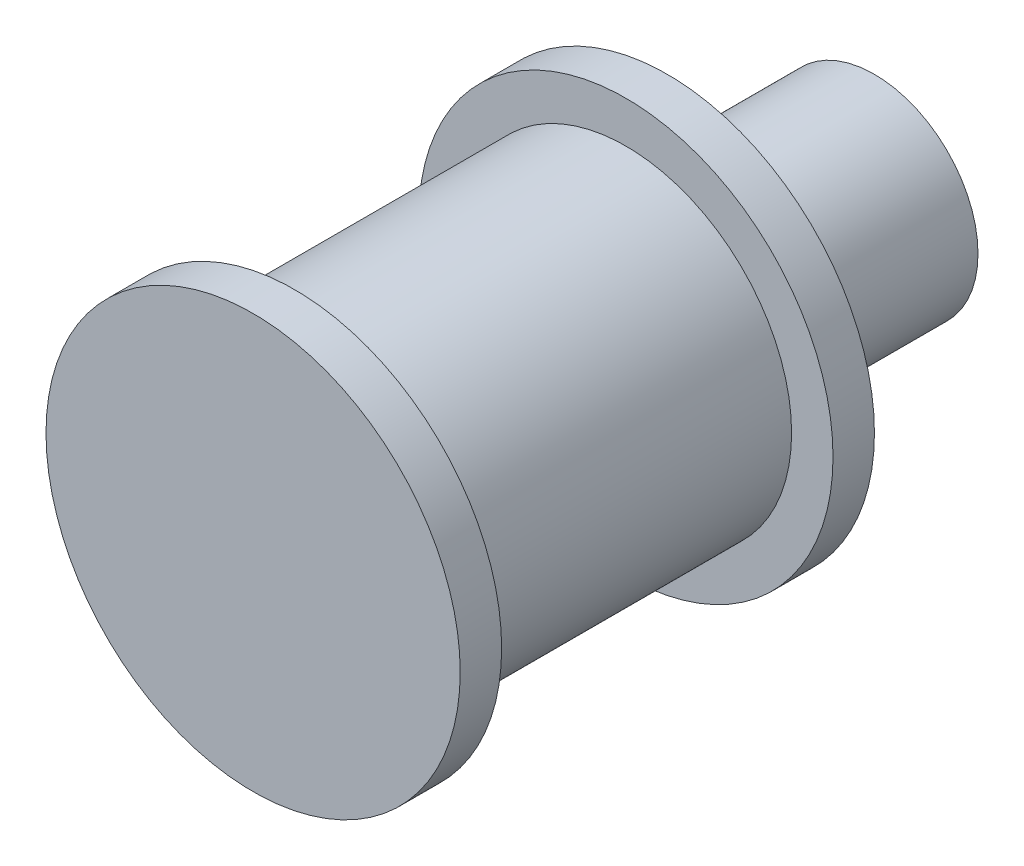
ISO-10303-21;
HEADER;
FILE_DESCRIPTION(('STEP AP214'),'2;1');
FILE_NAME('part.step','',(''),(''),'','','');
FILE_SCHEMA(('AUTOMOTIVE_DESIGN { 1 0 10303 214 1 1 1 1 }'));
ENDSEC;
DATA;
#1=APPLICATION_CONTEXT('core data for automotive mechanical design processes');
#2=APPLICATION_PROTOCOL_DEFINITION('international standard','automotive_design',2000,#1);
#3=PRODUCT_CONTEXT('',#1,'mechanical');
#4=PRODUCT('Part','Part','',(#3));
#5=PRODUCT_RELATED_PRODUCT_CATEGORY('part','',(#4));
#6=PRODUCT_DEFINITION_FORMATION('','',#4);
#7=PRODUCT_DEFINITION_CONTEXT('part definition',#1,'design');
#8=PRODUCT_DEFINITION('design','',#6,#7);
#9=PRODUCT_DEFINITION_SHAPE('','',#8);
#10=(LENGTH_UNIT() NAMED_UNIT(*) SI_UNIT(.MILLI.,.METRE.));
#11=(NAMED_UNIT(*) PLANE_ANGLE_UNIT() SI_UNIT($,.RADIAN.));
#12=(NAMED_UNIT(*) SI_UNIT($,.STERADIAN.) SOLID_ANGLE_UNIT());
#13=UNCERTAINTY_MEASURE_WITH_UNIT(LENGTH_MEASURE(1.E-05),#10,'distance_accuracy_value','');
#14=(GEOMETRIC_REPRESENTATION_CONTEXT(3) GLOBAL_UNCERTAINTY_ASSIGNED_CONTEXT((#13)) GLOBAL_UNIT_ASSIGNED_CONTEXT((#10,
#11,#12)) REPRESENTATION_CONTEXT('',''));
#15=CARTESIAN_POINT('',(0.,0.,0.));
#16=DIRECTION('',(0.,0.,1.));
#17=DIRECTION('',(1.,0.,0.));
#18=AXIS2_PLACEMENT_3D('',#15,#16,#17);
#19=CARTESIAN_POINT('',(0.,0.,5.));
#20=DIRECTION('',(0.,0.,-1.));
#21=DIRECTION('',(-1.,0.,0.));
#22=AXIS2_PLACEMENT_3D('',#19,#20,#21);
#23=CYLINDRICAL_SURFACE('',#22,2.5);
#24=CARTESIAN_POINT('',(0.,0.,5.));
#25=DIRECTION('',(0.,0.,1.));
#26=DIRECTION('',(1.,0.,0.));
#27=AXIS2_PLACEMENT_3D('',#24,#25,#26);
#28=CIRCLE('',#27,2.5);
#29=CARTESIAN_POINT('',(2.5,0.,5.));
#30=VERTEX_POINT('',#29);
#31=EDGE_CURVE('E38',#30,#30,#28,.T.);
#32=ORIENTED_EDGE('',*,*,#31,.F.);
#33=EDGE_LOOP('',(#32));
#34=FACE_BOUND('',#33,.T.);
#35=CARTESIAN_POINT('',(0.,0.,0.));
#36=DIRECTION('',(0.,0.,1.));
#37=DIRECTION('',(1.,0.,0.));
#38=AXIS2_PLACEMENT_3D('',#35,#36,#37);
#39=CIRCLE('',#38,2.5);
#40=CARTESIAN_POINT('',(2.5,0.,0.));
#41=VERTEX_POINT('',#40);
#42=EDGE_CURVE('E34',#41,#41,#39,.T.);
#43=ORIENTED_EDGE('',*,*,#42,.T.);
#44=EDGE_LOOP('',(#43));
#45=FACE_BOUND('',#44,.T.);
#46=ADVANCED_FACE('F31',(#34,#45),#23,.T.);
#47=CARTESIAN_POINT('',(0.,0.,0.));
#48=DIRECTION('',(0.,0.,1.));
#49=DIRECTION('',(1.,0.,0.));
#50=AXIS2_PLACEMENT_3D('',#47,#48,#49);
#51=PLANE('',#50);
#52=ORIENTED_EDGE('',*,*,#42,.F.);
#53=EDGE_LOOP('',(#52));
#54=FACE_BOUND('',#53,.T.);
#55=ADVANCED_FACE('F78',(#54),#51,.F.);
#56=CARTESIAN_POINT('',(0.,0.,6.));
#57=DIRECTION('',(0.,0.,-1.));
#58=DIRECTION('',(-1.,0.,0.));
#59=AXIS2_PLACEMENT_3D('',#56,#57,#58);
#60=CYLINDRICAL_SURFACE('',#59,5.);
#61=CARTESIAN_POINT('',(0.,0.,6.));
#62=DIRECTION('',(0.,0.,1.));
#63=DIRECTION('',(1.,0.,0.));
#64=AXIS2_PLACEMENT_3D('',#61,#62,#63);
#65=CIRCLE('',#64,5.);
#66=CARTESIAN_POINT('',(5.,0.,6.));
#67=VERTEX_POINT('',#66);
#68=EDGE_CURVE('E47',#67,#67,#65,.T.);
#69=ORIENTED_EDGE('',*,*,#68,.F.);
#70=EDGE_LOOP('',(#69));
#71=FACE_BOUND('',#70,.T.);
#72=CARTESIAN_POINT('',(0.,0.,5.));
#73=DIRECTION('',(0.,0.,1.));
#74=DIRECTION('',(1.,0.,0.));
#75=AXIS2_PLACEMENT_3D('',#72,#73,#74);
#76=CIRCLE('',#75,5.);
#77=CARTESIAN_POINT('',(5.,0.,5.));
#78=VERTEX_POINT('',#77);
#79=EDGE_CURVE('E50',#78,#78,#76,.T.);
#80=ORIENTED_EDGE('',*,*,#79,.T.);
#81=EDGE_LOOP('',(#80));
#82=FACE_BOUND('',#81,.T.);
#83=ADVANCED_FACE('F83',(#71,#82),#60,.T.);
#84=CARTESIAN_POINT('',(0.,0.,6.));
#85=DIRECTION('',(0.,0.,1.));
#86=DIRECTION('',(1.,0.,0.));
#87=AXIS2_PLACEMENT_3D('',#84,#85,#86);
#88=PLANE('',#87);
#89=CARTESIAN_POINT('',(0.,0.,6.));
#90=DIRECTION('',(0.,0.,1.));
#91=DIRECTION('',(1.,0.,0.));
#92=AXIS2_PLACEMENT_3D('',#89,#90,#91);
#93=CIRCLE('',#92,4.);
#94=CARTESIAN_POINT('',(4.,0.,6.));
#95=VERTEX_POINT('',#94);
#96=EDGE_CURVE('E10',#95,#95,#93,.T.);
#97=ORIENTED_EDGE('',*,*,#96,.F.);
#98=EDGE_LOOP('',(#97));
#99=FACE_BOUND('',#98,.T.);
#100=ORIENTED_EDGE('',*,*,#68,.T.);
#101=EDGE_LOOP('',(#100));
#102=FACE_BOUND('',#101,.T.);
#103=ADVANCED_FACE('F94',(#99,#102),#88,.T.);
#104=CARTESIAN_POINT('',(0.,0.,5.));
#105=DIRECTION('',(0.,0.,1.));
#106=DIRECTION('',(1.,0.,0.));
#107=AXIS2_PLACEMENT_3D('',#104,#105,#106);
#108=PLANE('',#107);
#109=ORIENTED_EDGE('',*,*,#31,.T.);
#110=EDGE_LOOP('',(#109));
#111=FACE_BOUND('',#110,.T.);
#112=ORIENTED_EDGE('',*,*,#79,.F.);
#113=EDGE_LOOP('',(#112));
#114=FACE_BOUND('',#113,.T.);
#115=ADVANCED_FACE('F90',(#111,#114),#108,.F.);
#116=CARTESIAN_POINT('',(0.,0.,14.));
#117=DIRECTION('',(0.,0.,-1.));
#118=DIRECTION('',(-1.,0.,0.));
#119=AXIS2_PLACEMENT_3D('',#116,#117,#118);
#120=CYLINDRICAL_SURFACE('',#119,4.);
#121=CARTESIAN_POINT('',(0.,0.,14.));
#122=DIRECTION('',(0.,0.,1.));
#123=DIRECTION('',(1.,0.,0.));
#124=AXIS2_PLACEMENT_3D('',#121,#122,#123);
#125=CIRCLE('',#124,4.);
#126=CARTESIAN_POINT('',(4.,0.,14.));
#127=VERTEX_POINT('',#126);
#128=EDGE_CURVE('E45',#127,#127,#125,.T.);
#129=ORIENTED_EDGE('',*,*,#128,.F.);
#130=EDGE_LOOP('',(#129));
#131=FACE_BOUND('',#130,.T.);
#132=ORIENTED_EDGE('',*,*,#96,.T.);
#133=EDGE_LOOP('',(#132));
#134=FACE_BOUND('',#133,.T.);
#135=ADVANCED_FACE('F93',(#131,#134),#120,.T.);
#136=CARTESIAN_POINT('',(0.,0.,15.));
#137=DIRECTION('',(0.,0.,-1.));
#138=DIRECTION('',(-1.,0.,0.));
#139=AXIS2_PLACEMENT_3D('',#136,#137,#138);
#140=CYLINDRICAL_SURFACE('',#139,5.);
#141=CARTESIAN_POINT('',(0.,0.,15.));
#142=DIRECTION('',(0.,0.,1.));
#143=DIRECTION('',(1.,0.,0.));
#144=AXIS2_PLACEMENT_3D('',#141,#142,#143);
#145=CIRCLE('',#144,5.);
#146=CARTESIAN_POINT('',(5.,0.,15.));
#147=VERTEX_POINT('',#146);
#148=EDGE_CURVE('E55',#147,#147,#145,.T.);
#149=ORIENTED_EDGE('',*,*,#148,.F.);
#150=EDGE_LOOP('',(#149));
#151=FACE_BOUND('',#150,.T.);
#152=CARTESIAN_POINT('',(0.,0.,14.));
#153=DIRECTION('',(0.,0.,1.));
#154=DIRECTION('',(1.,0.,0.));
#155=AXIS2_PLACEMENT_3D('',#152,#153,#154);
#156=CIRCLE('',#155,5.);
#157=CARTESIAN_POINT('',(5.,0.,14.));
#158=VERTEX_POINT('',#157);
#159=EDGE_CURVE('E59',#158,#158,#156,.T.);
#160=ORIENTED_EDGE('',*,*,#159,.T.);
#161=EDGE_LOOP('',(#160));
#162=FACE_BOUND('',#161,.T.);
#163=ADVANCED_FACE('F66',(#151,#162),#140,.T.);
#164=CARTESIAN_POINT('',(0.,0.,15.));
#165=DIRECTION('',(0.,0.,1.));
#166=DIRECTION('',(1.,0.,0.));
#167=AXIS2_PLACEMENT_3D('',#164,#165,#166);
#168=PLANE('',#167);
#169=ORIENTED_EDGE('',*,*,#148,.T.);
#170=EDGE_LOOP('',(#169));
#171=FACE_BOUND('',#170,.T.);
#172=ADVANCED_FACE('F70',(#171),#168,.T.);
#173=CARTESIAN_POINT('',(0.,0.,14.));
#174=DIRECTION('',(0.,0.,1.));
#175=DIRECTION('',(1.,0.,0.));
#176=AXIS2_PLACEMENT_3D('',#173,#174,#175);
#177=PLANE('',#176);
#178=ORIENTED_EDGE('',*,*,#128,.T.);
#179=EDGE_LOOP('',(#178));
#180=FACE_BOUND('',#179,.T.);
#181=ORIENTED_EDGE('',*,*,#159,.F.);
#182=EDGE_LOOP('',(#181));
#183=FACE_BOUND('',#182,.T.);
#184=ADVANCED_FACE('F68',(#180,#183),#177,.F.);
#185=CLOSED_SHELL('',(#46,#55,#83,#103,#115,#135,#163,#172,#184));
#186=MANIFOLD_SOLID_BREP('B2',#185);
#187=ADVANCED_BREP_SHAPE_REPRESENTATION('',(#18,#186),#14);
#188=SHAPE_DEFINITION_REPRESENTATION(#9,#187);
ENDSEC;
END-ISO-10303-21;
